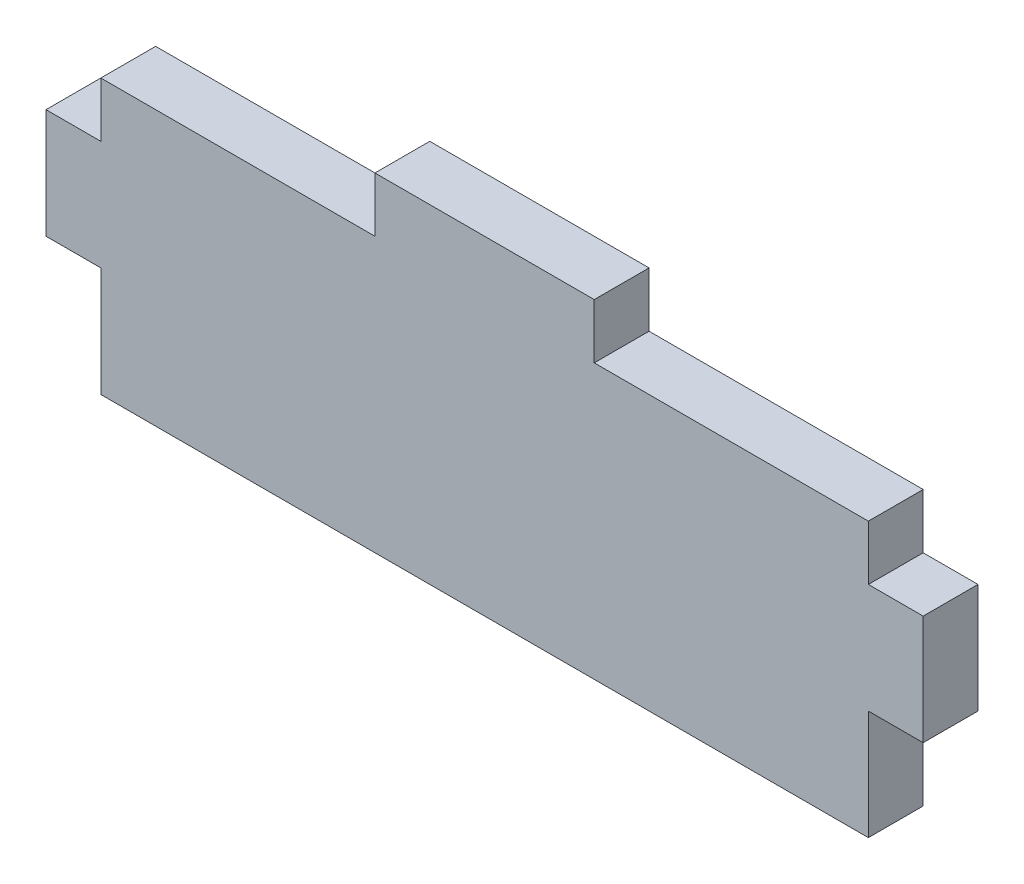
ISO-10303-21;
HEADER;
FILE_DESCRIPTION(('STEP AP214'),'2;1');
FILE_NAME('part.step','',(''),(''),'','','');
FILE_SCHEMA(('AUTOMOTIVE_DESIGN { 1 0 10303 214 1 1 1 1 }'));
ENDSEC;
DATA;
#1=APPLICATION_CONTEXT('core data for automotive mechanical design processes');
#2=APPLICATION_PROTOCOL_DEFINITION('international standard','automotive_design',2000,#1);
#3=PRODUCT_CONTEXT('',#1,'mechanical');
#4=PRODUCT('Part','Part','',(#3));
#5=PRODUCT_RELATED_PRODUCT_CATEGORY('part','',(#4));
#6=PRODUCT_DEFINITION_FORMATION('','',#4);
#7=PRODUCT_DEFINITION_CONTEXT('part definition',#1,'design');
#8=PRODUCT_DEFINITION('design','',#6,#7);
#9=PRODUCT_DEFINITION_SHAPE('','',#8);
#10=(LENGTH_UNIT() NAMED_UNIT(*) SI_UNIT(.MILLI.,.METRE.));
#11=(NAMED_UNIT(*) PLANE_ANGLE_UNIT() SI_UNIT($,.RADIAN.));
#12=(NAMED_UNIT(*) SI_UNIT($,.STERADIAN.) SOLID_ANGLE_UNIT());
#13=UNCERTAINTY_MEASURE_WITH_UNIT(LENGTH_MEASURE(1.E-05),#10,'distance_accuracy_value','');
#14=(GEOMETRIC_REPRESENTATION_CONTEXT(3) GLOBAL_UNCERTAINTY_ASSIGNED_CONTEXT((#13)) GLOBAL_UNIT_ASSIGNED_CONTEXT((#10,
#11,#12)) REPRESENTATION_CONTEXT('',''));
#15=CARTESIAN_POINT('',(0.,0.,0.));
#16=DIRECTION('',(0.,0.,1.));
#17=DIRECTION('',(1.,0.,0.));
#18=AXIS2_PLACEMENT_3D('',#15,#16,#17);
#19=CARTESIAN_POINT('',(83.7836782164158,0.,6.35));
#20=DIRECTION('',(1.,0.,0.));
#21=DIRECTION('',(0.,1.,0.));
#22=AXIS2_PLACEMENT_3D('',#19,#20,#21);
#23=PLANE('',#22);
#24=DIRECTION('',(0.,-1.,0.));
#25=VECTOR('',#24,1.);
#26=CARTESIAN_POINT('',(83.7836782164158,0.,0.));
#27=LINE('',#26,#25);
#28=CARTESIAN_POINT('',(83.7836782164158,19.051893638171,0.));
#29=VERTEX_POINT('',#28);
#30=CARTESIAN_POINT('',(83.7836782164158,12.701893638171,0.));
#31=VERTEX_POINT('',#30);
#32=EDGE_CURVE('E176',#29,#31,#27,.T.);
#33=ORIENTED_EDGE('',*,*,#32,.F.);
#34=DIRECTION('',(0.,0.,-1.));
#35=VECTOR('',#34,1.);
#36=CARTESIAN_POINT('',(83.7836782164158,19.051893638171,6.35));
#37=LINE('',#36,#35);
#38=CARTESIAN_POINT('',(83.7836782164158,19.051893638171,6.35));
#39=VERTEX_POINT('',#38);
#40=EDGE_CURVE('E11',#39,#29,#37,.T.);
#41=ORIENTED_EDGE('',*,*,#40,.F.);
#42=DIRECTION('',(0.,-1.,0.));
#43=VECTOR('',#42,1.);
#44=CARTESIAN_POINT('',(83.7836782164158,0.,6.35));
#45=LINE('',#44,#43);
#46=CARTESIAN_POINT('',(83.7836782164158,12.701893638171,6.35));
#47=VERTEX_POINT('',#46);
#48=EDGE_CURVE('E212',#39,#47,#45,.T.);
#49=ORIENTED_EDGE('',*,*,#48,.T.);
#50=DIRECTION('',(0.,0.,-1.));
#51=VECTOR('',#50,1.);
#52=CARTESIAN_POINT('',(83.7836782164158,12.701893638171,6.35));
#53=LINE('',#52,#51);
#54=EDGE_CURVE('E52',#47,#31,#53,.T.);
#55=ORIENTED_EDGE('',*,*,#54,.T.);
#56=EDGE_LOOP('',(#33,#41,#49,#55));
#57=FACE_BOUND('',#56,.T.);
#58=ADVANCED_FACE('F35',(#57),#23,.T.);
#59=CARTESIAN_POINT('',(0.,19.051893638171,6.35));
#60=DIRECTION('',(0.,1.,0.));
#61=DIRECTION('',(-1.,0.,0.));
#62=AXIS2_PLACEMENT_3D('',#59,#60,#61);
#63=PLANE('',#62);
#64=DIRECTION('',(1.,0.,0.));
#65=VECTOR('',#64,1.);
#66=CARTESIAN_POINT('',(0.,19.051893638171,0.));
#67=LINE('',#66,#65);
#68=CARTESIAN_POINT('',(52.0336782164157,19.051893638171,0.));
#69=VERTEX_POINT('',#68);
#70=EDGE_CURVE('E178',#69,#29,#67,.T.);
#71=ORIENTED_EDGE('',*,*,#70,.F.);
#72=DIRECTION('',(0.,0.,-1.));
#73=VECTOR('',#72,1.);
#74=CARTESIAN_POINT('',(52.0336782164157,19.051893638171,6.35));
#75=LINE('',#74,#73);
#76=CARTESIAN_POINT('',(52.0336782164157,19.051893638171,6.35));
#77=VERTEX_POINT('',#76);
#78=EDGE_CURVE('E44',#77,#69,#75,.T.);
#79=ORIENTED_EDGE('',*,*,#78,.F.);
#80=DIRECTION('',(1.,0.,0.));
#81=VECTOR('',#80,1.);
#82=CARTESIAN_POINT('',(0.,19.051893638171,6.35));
#83=LINE('',#82,#81);
#84=EDGE_CURVE('E259',#77,#39,#83,.T.);
#85=ORIENTED_EDGE('',*,*,#84,.T.);
#86=ORIENTED_EDGE('',*,*,#40,.T.);
#87=EDGE_LOOP('',(#71,#79,#85,#86));
#88=FACE_BOUND('',#87,.T.);
#89=ADVANCED_FACE('F247',(#88),#63,.T.);
#90=CARTESIAN_POINT('',(52.0336782164157,0.,6.35));
#91=DIRECTION('',(1.,0.,0.));
#92=DIRECTION('',(0.,0.,-1.));
#93=AXIS2_PLACEMENT_3D('',#90,#91,#92);
#94=PLANE('',#93);
#95=DIRECTION('',(0.,-1.,0.));
#96=VECTOR('',#95,1.);
#97=CARTESIAN_POINT('',(52.0336782164157,0.,0.));
#98=LINE('',#97,#96);
#99=CARTESIAN_POINT('',(52.0336782164157,25.401893638171,0.));
#100=VERTEX_POINT('',#99);
#101=EDGE_CURVE('E182',#100,#69,#98,.T.);
#102=ORIENTED_EDGE('',*,*,#101,.F.);
#103=DIRECTION('',(0.,0.,-1.));
#104=VECTOR('',#103,1.);
#105=CARTESIAN_POINT('',(52.0336782164157,25.401893638171,6.35));
#106=LINE('',#105,#104);
#107=CARTESIAN_POINT('',(52.0336782164157,25.401893638171,6.35));
#108=VERTEX_POINT('',#107);
#109=EDGE_CURVE('E237',#108,#100,#106,.T.);
#110=ORIENTED_EDGE('',*,*,#109,.F.);
#111=DIRECTION('',(0.,-1.,0.));
#112=VECTOR('',#111,1.);
#113=CARTESIAN_POINT('',(52.0336782164157,0.,6.35));
#114=LINE('',#113,#112);
#115=EDGE_CURVE('E243',#108,#77,#114,.T.);
#116=ORIENTED_EDGE('',*,*,#115,.T.);
#117=ORIENTED_EDGE('',*,*,#78,.T.);
#118=EDGE_LOOP('',(#102,#110,#116,#117));
#119=FACE_BOUND('',#118,.T.);
#120=ADVANCED_FACE('F37',(#119),#94,.T.);
#121=CARTESIAN_POINT('',(0.,25.401893638171,6.35));
#122=DIRECTION('',(0.,1.,0.));
#123=DIRECTION('',(0.,0.,1.));
#124=AXIS2_PLACEMENT_3D('',#121,#122,#123);
#125=PLANE('',#124);
#126=DIRECTION('',(1.,0.,0.));
#127=VECTOR('',#126,1.);
#128=CARTESIAN_POINT('',(0.,25.401893638171,0.));
#129=LINE('',#128,#127);
#130=CARTESIAN_POINT('',(26.6336782164157,25.401893638171,0.));
#131=VERTEX_POINT('',#130);
#132=EDGE_CURVE('E186',#131,#100,#129,.T.);
#133=ORIENTED_EDGE('',*,*,#132,.F.);
#134=DIRECTION('',(0.,0.,-1.));
#135=VECTOR('',#134,1.);
#136=CARTESIAN_POINT('',(26.6336782164157,25.401893638171,6.35));
#137=LINE('',#136,#135);
#138=CARTESIAN_POINT('',(26.6336782164157,25.401893638171,6.35));
#139=VERTEX_POINT('',#138);
#140=EDGE_CURVE('E235',#139,#131,#137,.T.);
#141=ORIENTED_EDGE('',*,*,#140,.F.);
#142=DIRECTION('',(1.,0.,0.));
#143=VECTOR('',#142,1.);
#144=CARTESIAN_POINT('',(0.,25.401893638171,6.35));
#145=LINE('',#144,#143);
#146=EDGE_CURVE('E258',#139,#108,#145,.T.);
#147=ORIENTED_EDGE('',*,*,#146,.T.);
#148=ORIENTED_EDGE('',*,*,#109,.T.);
#149=EDGE_LOOP('',(#133,#141,#147,#148));
#150=FACE_BOUND('',#149,.T.);
#151=ADVANCED_FACE('F254',(#150),#125,.T.);
#152=CARTESIAN_POINT('',(26.6336782164157,0.,6.35));
#153=DIRECTION('',(1.,0.,0.));
#154=DIRECTION('',(0.,1.,0.));
#155=AXIS2_PLACEMENT_3D('',#152,#153,#154);
#156=PLANE('',#155);
#157=DIRECTION('',(0.,-1.,0.));
#158=VECTOR('',#157,1.);
#159=CARTESIAN_POINT('',(26.6336782164157,0.,0.));
#160=LINE('',#159,#158);
#161=CARTESIAN_POINT('',(26.6336782164157,19.051893638171,0.));
#162=VERTEX_POINT('',#161);
#163=EDGE_CURVE('E189',#131,#162,#160,.T.);
#164=ORIENTED_EDGE('',*,*,#163,.T.);
#165=DIRECTION('',(0.,0.,-1.));
#166=VECTOR('',#165,1.);
#167=CARTESIAN_POINT('',(26.6336782164157,19.051893638171,6.35));
#168=LINE('',#167,#166);
#169=CARTESIAN_POINT('',(26.6336782164157,19.051893638171,6.35));
#170=VERTEX_POINT('',#169);
#171=EDGE_CURVE('E233',#170,#162,#168,.T.);
#172=ORIENTED_EDGE('',*,*,#171,.F.);
#173=DIRECTION('',(0.,-1.,0.));
#174=VECTOR('',#173,1.);
#175=CARTESIAN_POINT('',(26.6336782164157,0.,6.35));
#176=LINE('',#175,#174);
#177=EDGE_CURVE('E261',#139,#170,#176,.T.);
#178=ORIENTED_EDGE('',*,*,#177,.F.);
#179=ORIENTED_EDGE('',*,*,#140,.T.);
#180=EDGE_LOOP('',(#164,#172,#178,#179));
#181=FACE_BOUND('',#180,.T.);
#182=ADVANCED_FACE('F337',(#181),#156,.F.);
#183=CARTESIAN_POINT('',(-5.11632178358423,19.051893638171,0.));
#184=VERTEX_POINT('',#183);
#185=EDGE_CURVE('E183',#184,#162,#67,.T.);
#186=ORIENTED_EDGE('',*,*,#185,.F.);
#187=DIRECTION('',(0.,0.,-1.));
#188=VECTOR('',#187,1.);
#189=CARTESIAN_POINT('',(-5.11632178358423,19.051893638171,6.35));
#190=LINE('',#189,#188);
#191=CARTESIAN_POINT('',(-5.11632178358423,19.051893638171,6.35));
#192=VERTEX_POINT('',#191);
#193=EDGE_CURVE('E231',#192,#184,#190,.T.);
#194=ORIENTED_EDGE('',*,*,#193,.F.);
#195=EDGE_CURVE('E264',#192,#170,#83,.T.);
#196=ORIENTED_EDGE('',*,*,#195,.T.);
#197=ORIENTED_EDGE('',*,*,#171,.T.);
#198=EDGE_LOOP('',(#186,#194,#196,#197));
#199=FACE_BOUND('',#198,.T.);
#200=ADVANCED_FACE('F310',(#199),#63,.T.);
#201=CARTESIAN_POINT('',(-5.11632178358423,0.,6.35));
#202=DIRECTION('',(1.,0.,0.));
#203=DIRECTION('',(0.,1.,0.));
#204=AXIS2_PLACEMENT_3D('',#201,#202,#203);
#205=PLANE('',#204);
#206=DIRECTION('',(0.,-1.,0.));
#207=VECTOR('',#206,1.);
#208=CARTESIAN_POINT('',(-5.11632178358423,0.,0.));
#209=LINE('',#208,#207);
#210=CARTESIAN_POINT('',(-5.11632178358423,12.701893638171,0.));
#211=VERTEX_POINT('',#210);
#212=EDGE_CURVE('E192',#184,#211,#209,.T.);
#213=ORIENTED_EDGE('',*,*,#212,.T.);
#214=DIRECTION('',(0.,0.,-1.));
#215=VECTOR('',#214,1.);
#216=CARTESIAN_POINT('',(-5.11632178358423,12.701893638171,6.35));
#217=LINE('',#216,#215);
#218=CARTESIAN_POINT('',(-5.11632178358423,12.701893638171,6.35));
#219=VERTEX_POINT('',#218);
#220=EDGE_CURVE('E229',#219,#211,#217,.T.);
#221=ORIENTED_EDGE('',*,*,#220,.F.);
#222=DIRECTION('',(0.,-1.,0.));
#223=VECTOR('',#222,1.);
#224=CARTESIAN_POINT('',(-5.11632178358423,0.,6.35));
#225=LINE('',#224,#223);
#226=EDGE_CURVE('E268',#192,#219,#225,.T.);
#227=ORIENTED_EDGE('',*,*,#226,.F.);
#228=ORIENTED_EDGE('',*,*,#193,.T.);
#229=EDGE_LOOP('',(#213,#221,#227,#228));
#230=FACE_BOUND('',#229,.T.);
#231=ADVANCED_FACE('F323',(#230),#205,.F.);
#232=CARTESIAN_POINT('',(0.,12.701893638171,6.35));
#233=DIRECTION('',(0.,1.,0.));
#234=DIRECTION('',(-1.,0.,0.));
#235=AXIS2_PLACEMENT_3D('',#232,#233,#234);
#236=PLANE('',#235);
#237=DIRECTION('',(1.,0.,0.));
#238=VECTOR('',#237,1.);
#239=CARTESIAN_POINT('',(0.,12.701893638171,0.));
#240=LINE('',#239,#238);
#241=CARTESIAN_POINT('',(-11.4663217835842,12.701893638171,0.));
#242=VERTEX_POINT('',#241);
#243=EDGE_CURVE('E195',#242,#211,#240,.T.);
#244=ORIENTED_EDGE('',*,*,#243,.F.);
#245=DIRECTION('',(0.,0.,-1.));
#246=VECTOR('',#245,1.);
#247=CARTESIAN_POINT('',(-11.4663217835842,12.701893638171,6.35));
#248=LINE('',#247,#246);
#249=CARTESIAN_POINT('',(-11.4663217835842,12.701893638171,6.35));
#250=VERTEX_POINT('',#249);
#251=EDGE_CURVE('E227',#250,#242,#248,.T.);
#252=ORIENTED_EDGE('',*,*,#251,.F.);
#253=DIRECTION('',(1.,0.,0.));
#254=VECTOR('',#253,1.);
#255=CARTESIAN_POINT('',(0.,12.701893638171,6.35));
#256=LINE('',#255,#254);
#257=EDGE_CURVE('E270',#250,#219,#256,.T.);
#258=ORIENTED_EDGE('',*,*,#257,.T.);
#259=ORIENTED_EDGE('',*,*,#220,.T.);
#260=EDGE_LOOP('',(#244,#252,#258,#259));
#261=FACE_BOUND('',#260,.T.);
#262=ADVANCED_FACE('F331',(#261),#236,.T.);
#263=CARTESIAN_POINT('',(-11.4663217835842,0.,6.35));
#264=DIRECTION('',(1.,0.,0.));
#265=DIRECTION('',(0.,1.,0.));
#266=AXIS2_PLACEMENT_3D('',#263,#264,#265);
#267=PLANE('',#266);
#268=DIRECTION('',(0.,-1.,0.));
#269=VECTOR('',#268,1.);
#270=CARTESIAN_POINT('',(-11.4663217835842,0.,0.));
#271=LINE('',#270,#269);
#272=CARTESIAN_POINT('',(-11.4663217835842,0.00189363817097721,0.));
#273=VERTEX_POINT('',#272);
#274=EDGE_CURVE('E199',#242,#273,#271,.T.);
#275=ORIENTED_EDGE('',*,*,#274,.T.);
#276=DIRECTION('',(0.,0.,-1.));
#277=VECTOR('',#276,1.);
#278=CARTESIAN_POINT('',(-11.4663217835842,0.00189363817097721,6.35));
#279=LINE('',#278,#277);
#280=CARTESIAN_POINT('',(-11.4663217835842,0.00189363817097721,6.35));
#281=VERTEX_POINT('',#280);
#282=EDGE_CURVE('E224',#281,#273,#279,.T.);
#283=ORIENTED_EDGE('',*,*,#282,.F.);
#284=DIRECTION('',(0.,-1.,0.));
#285=VECTOR('',#284,1.);
#286=CARTESIAN_POINT('',(-11.4663217835842,0.,6.35));
#287=LINE('',#286,#285);
#288=EDGE_CURVE('E274',#250,#281,#287,.T.);
#289=ORIENTED_EDGE('',*,*,#288,.F.);
#290=ORIENTED_EDGE('',*,*,#251,.T.);
#291=EDGE_LOOP('',(#275,#283,#289,#290));
#292=FACE_BOUND('',#291,.T.);
#293=ADVANCED_FACE('F327',(#292),#267,.F.);
#294=CARTESIAN_POINT('',(0.,0.00189363817097721,6.35));
#295=DIRECTION('',(0.,1.,0.));
#296=DIRECTION('',(0.,0.,1.));
#297=AXIS2_PLACEMENT_3D('',#294,#295,#296);
#298=PLANE('',#297);
#299=DIRECTION('',(1.,0.,0.));
#300=VECTOR('',#299,1.);
#301=CARTESIAN_POINT('',(0.,0.00189363817097721,0.));
#302=LINE('',#301,#300);
#303=CARTESIAN_POINT('',(-5.11632178358423,0.00189363817097721,0.));
#304=VERTEX_POINT('',#303);
#305=EDGE_CURVE('E201',#273,#304,#302,.T.);
#306=ORIENTED_EDGE('',*,*,#305,.T.);
#307=DIRECTION('',(0.,0.,-1.));
#308=VECTOR('',#307,1.);
#309=CARTESIAN_POINT('',(-5.11632178358423,0.00189363817097721,6.35));
#310=LINE('',#309,#308);
#311=CARTESIAN_POINT('',(-5.11632178358423,0.00189363817097721,6.35));
#312=VERTEX_POINT('',#311);
#313=EDGE_CURVE('E221',#312,#304,#310,.T.);
#314=ORIENTED_EDGE('',*,*,#313,.F.);
#315=DIRECTION('',(1.,0.,0.));
#316=VECTOR('',#315,1.);
#317=CARTESIAN_POINT('',(0.,0.00189363817097721,6.35));
#318=LINE('',#317,#316);
#319=EDGE_CURVE('E276',#281,#312,#318,.T.);
#320=ORIENTED_EDGE('',*,*,#319,.F.);
#321=ORIENTED_EDGE('',*,*,#282,.T.);
#322=EDGE_LOOP('',(#306,#314,#320,#321));
#323=FACE_BOUND('',#322,.T.);
#324=ADVANCED_FACE('F321',(#323),#298,.F.);
#325=CARTESIAN_POINT('',(-5.11632178358423,-12.698106361829,0.));
#326=VERTEX_POINT('',#325);
#327=EDGE_CURVE('E196',#304,#326,#209,.T.);
#328=ORIENTED_EDGE('',*,*,#327,.T.);
#329=DIRECTION('',(0.,0.,-1.));
#330=VECTOR('',#329,1.);
#331=CARTESIAN_POINT('',(-5.11632178358423,-12.698106361829,6.35));
#332=LINE('',#331,#330);
#333=CARTESIAN_POINT('',(-5.11632178358423,-12.698106361829,6.35));
#334=VERTEX_POINT('',#333);
#335=EDGE_CURVE('E218',#334,#326,#332,.T.);
#336=ORIENTED_EDGE('',*,*,#335,.F.);
#337=EDGE_CURVE('E271',#312,#334,#225,.T.);
#338=ORIENTED_EDGE('',*,*,#337,.F.);
#339=ORIENTED_EDGE('',*,*,#313,.T.);
#340=EDGE_LOOP('',(#328,#336,#338,#339));
#341=FACE_BOUND('',#340,.T.);
#342=ADVANCED_FACE('F285',(#341),#205,.F.);
#343=CARTESIAN_POINT('',(0.,-12.698106361829,6.35));
#344=DIRECTION('',(0.,1.,0.));
#345=DIRECTION('',(0.,0.,1.));
#346=AXIS2_PLACEMENT_3D('',#343,#344,#345);
#347=PLANE('',#346);
#348=DIRECTION('',(1.,0.,0.));
#349=VECTOR('',#348,1.);
#350=CARTESIAN_POINT('',(0.,-12.698106361829,0.));
#351=LINE('',#350,#349);
#352=CARTESIAN_POINT('',(83.7836782164158,-12.698106361829,0.));
#353=VERTEX_POINT('',#352);
#354=EDGE_CURVE('E203',#326,#353,#351,.T.);
#355=ORIENTED_EDGE('',*,*,#354,.T.);
#356=DIRECTION('',(0.,0.,-1.));
#357=VECTOR('',#356,1.);
#358=CARTESIAN_POINT('',(83.7836782164158,-12.698106361829,6.35));
#359=LINE('',#358,#357);
#360=CARTESIAN_POINT('',(83.7836782164158,-12.698106361829,6.35));
#361=VERTEX_POINT('',#360);
#362=EDGE_CURVE('E216',#361,#353,#359,.T.);
#363=ORIENTED_EDGE('',*,*,#362,.F.);
#364=DIRECTION('',(1.,0.,0.));
#365=VECTOR('',#364,1.);
#366=CARTESIAN_POINT('',(0.,-12.698106361829,6.35));
#367=LINE('',#366,#365);
#368=EDGE_CURVE('E277',#334,#361,#367,.T.);
#369=ORIENTED_EDGE('',*,*,#368,.F.);
#370=ORIENTED_EDGE('',*,*,#335,.T.);
#371=EDGE_LOOP('',(#355,#363,#369,#370));
#372=FACE_BOUND('',#371,.T.);
#373=ADVANCED_FACE('F289',(#372),#347,.F.);
#374=CARTESIAN_POINT('',(83.7836782164158,0.00189363817097591,0.));
#375=VERTEX_POINT('',#374);
#376=EDGE_CURVE('E179',#375,#353,#27,.T.);
#377=ORIENTED_EDGE('',*,*,#376,.F.);
#378=DIRECTION('',(0.,0.,-1.));
#379=VECTOR('',#378,1.);
#380=CARTESIAN_POINT('',(83.7836782164158,0.00189363817097591,6.35));
#381=LINE('',#380,#379);
#382=CARTESIAN_POINT('',(83.7836782164158,0.00189363817097591,6.35));
#383=VERTEX_POINT('',#382);
#384=EDGE_CURVE('E168',#383,#375,#381,.T.);
#385=ORIENTED_EDGE('',*,*,#384,.F.);
#386=EDGE_CURVE('E158',#383,#361,#45,.T.);
#387=ORIENTED_EDGE('',*,*,#386,.T.);
#388=ORIENTED_EDGE('',*,*,#362,.T.);
#389=EDGE_LOOP('',(#377,#385,#387,#388));
#390=FACE_BOUND('',#389,.T.);
#391=ADVANCED_FACE('F293',(#390),#23,.T.);
#392=CARTESIAN_POINT('',(0.,0.00189363817098163,6.35));
#393=DIRECTION('',(0.,1.,0.));
#394=DIRECTION('',(-1.,0.,0.));
#395=AXIS2_PLACEMENT_3D('',#392,#393,#394);
#396=PLANE('',#395);
#397=DIRECTION('',(1.,0.,0.));
#398=VECTOR('',#397,1.);
#399=CARTESIAN_POINT('',(0.,0.00189363817098163,0.));
#400=LINE('',#399,#398);
#401=CARTESIAN_POINT('',(90.1336782164158,0.00189363817097547,0.));
#402=VERTEX_POINT('',#401);
#403=EDGE_CURVE('E165',#375,#402,#400,.T.);
#404=ORIENTED_EDGE('',*,*,#403,.T.);
#405=DIRECTION('',(0.,0.,-1.));
#406=VECTOR('',#405,1.);
#407=CARTESIAN_POINT('',(90.1336782164158,0.00189363817097547,6.35));
#408=LINE('',#407,#406);
#409=CARTESIAN_POINT('',(90.1336782164158,0.00189363817097547,6.35));
#410=VERTEX_POINT('',#409);
#411=EDGE_CURVE('E162',#410,#402,#408,.T.);
#412=ORIENTED_EDGE('',*,*,#411,.F.);
#413=DIRECTION('',(1.,0.,0.));
#414=VECTOR('',#413,1.);
#415=CARTESIAN_POINT('',(0.,0.00189363817098163,6.35));
#416=LINE('',#415,#414);
#417=EDGE_CURVE('E151',#383,#410,#416,.T.);
#418=ORIENTED_EDGE('',*,*,#417,.F.);
#419=ORIENTED_EDGE('',*,*,#384,.T.);
#420=EDGE_LOOP('',(#404,#412,#418,#419));
#421=FACE_BOUND('',#420,.T.);
#422=ADVANCED_FACE('F163',(#421),#396,.F.);
#423=CARTESIAN_POINT('',(90.1336782164158,0.,6.35));
#424=DIRECTION('',(1.,0.,0.));
#425=DIRECTION('',(0.,0.,-1.));
#426=AXIS2_PLACEMENT_3D('',#423,#424,#425);
#427=PLANE('',#426);
#428=DIRECTION('',(0.,-1.,0.));
#429=VECTOR('',#428,1.);
#430=CARTESIAN_POINT('',(90.1336782164158,0.,0.));
#431=LINE('',#430,#429);
#432=CARTESIAN_POINT('',(90.1336782164158,12.701893638171,0.));
#433=VERTEX_POINT('',#432);
#434=EDGE_CURVE('E207',#433,#402,#431,.T.);
#435=ORIENTED_EDGE('',*,*,#434,.F.);
#436=DIRECTION('',(0.,0.,-1.));
#437=VECTOR('',#436,1.);
#438=CARTESIAN_POINT('',(90.1336782164158,12.701893638171,6.35));
#439=LINE('',#438,#437);
#440=CARTESIAN_POINT('',(90.1336782164158,12.701893638171,6.35));
#441=VERTEX_POINT('',#440);
#442=EDGE_CURVE('E101',#441,#433,#439,.T.);
#443=ORIENTED_EDGE('',*,*,#442,.F.);
#444=DIRECTION('',(0.,-1.,0.));
#445=VECTOR('',#444,1.);
#446=CARTESIAN_POINT('',(90.1336782164158,0.,6.35));
#447=LINE('',#446,#445);
#448=EDGE_CURVE('E156',#441,#410,#447,.T.);
#449=ORIENTED_EDGE('',*,*,#448,.T.);
#450=ORIENTED_EDGE('',*,*,#411,.T.);
#451=EDGE_LOOP('',(#435,#443,#449,#450));
#452=FACE_BOUND('',#451,.T.);
#453=ADVANCED_FACE('F170',(#452),#427,.T.);
#454=CARTESIAN_POINT('',(0.,12.701893638171,6.35));
#455=DIRECTION('',(0.,1.,0.));
#456=DIRECTION('',(0.,0.,1.));
#457=AXIS2_PLACEMENT_3D('',#454,#455,#456);
#458=PLANE('',#457);
#459=DIRECTION('',(1.,0.,0.));
#460=VECTOR('',#459,1.);
#461=CARTESIAN_POINT('',(0.,12.701893638171,0.));
#462=LINE('',#461,#460);
#463=EDGE_CURVE('E209',#31,#433,#462,.T.);
#464=ORIENTED_EDGE('',*,*,#463,.F.);
#465=ORIENTED_EDGE('',*,*,#54,.F.);
#466=DIRECTION('',(1.,0.,0.));
#467=VECTOR('',#466,1.);
#468=CARTESIAN_POINT('',(0.,12.701893638171,6.35));
#469=LINE('',#468,#467);
#470=EDGE_CURVE('E171',#47,#441,#469,.T.);
#471=ORIENTED_EDGE('',*,*,#470,.T.);
#472=ORIENTED_EDGE('',*,*,#442,.T.);
#473=EDGE_LOOP('',(#464,#465,#471,#472));
#474=FACE_BOUND('',#473,.T.);
#475=ADVANCED_FACE('F294',(#474),#458,.T.);
#476=CARTESIAN_POINT('',(0.,0.,6.35));
#477=DIRECTION('',(0.,0.,1.));
#478=DIRECTION('',(1.,0.,0.));
#479=AXIS2_PLACEMENT_3D('',#476,#477,#478);
#480=PLANE('',#479);
#481=ORIENTED_EDGE('',*,*,#48,.F.);
#482=ORIENTED_EDGE('',*,*,#84,.F.);
#483=ORIENTED_EDGE('',*,*,#115,.F.);
#484=ORIENTED_EDGE('',*,*,#146,.F.);
#485=ORIENTED_EDGE('',*,*,#177,.T.);
#486=ORIENTED_EDGE('',*,*,#195,.F.);
#487=ORIENTED_EDGE('',*,*,#226,.T.);
#488=ORIENTED_EDGE('',*,*,#257,.F.);
#489=ORIENTED_EDGE('',*,*,#288,.T.);
#490=ORIENTED_EDGE('',*,*,#319,.T.);
#491=ORIENTED_EDGE('',*,*,#337,.T.);
#492=ORIENTED_EDGE('',*,*,#368,.T.);
#493=ORIENTED_EDGE('',*,*,#386,.F.);
#494=ORIENTED_EDGE('',*,*,#417,.T.);
#495=ORIENTED_EDGE('',*,*,#448,.F.);
#496=ORIENTED_EDGE('',*,*,#470,.F.);
#497=EDGE_LOOP('',(#481,#482,#483,#484,#485,#486,#487,#488,#489,#490,#491,#492,#493,#494,#495,#496));
#498=FACE_BOUND('',#497,.T.);
#499=ADVANCED_FACE('F153',(#498),#480,.T.);
#500=CARTESIAN_POINT('',(0.,0.,0.));
#501=DIRECTION('',(0.,0.,1.));
#502=DIRECTION('',(1.,0.,0.));
#503=AXIS2_PLACEMENT_3D('',#500,#501,#502);
#504=PLANE('',#503);
#505=ORIENTED_EDGE('',*,*,#32,.T.);
#506=ORIENTED_EDGE('',*,*,#463,.T.);
#507=ORIENTED_EDGE('',*,*,#434,.T.);
#508=ORIENTED_EDGE('',*,*,#403,.F.);
#509=ORIENTED_EDGE('',*,*,#376,.T.);
#510=ORIENTED_EDGE('',*,*,#354,.F.);
#511=ORIENTED_EDGE('',*,*,#327,.F.);
#512=ORIENTED_EDGE('',*,*,#305,.F.);
#513=ORIENTED_EDGE('',*,*,#274,.F.);
#514=ORIENTED_EDGE('',*,*,#243,.T.);
#515=ORIENTED_EDGE('',*,*,#212,.F.);
#516=ORIENTED_EDGE('',*,*,#185,.T.);
#517=ORIENTED_EDGE('',*,*,#163,.F.);
#518=ORIENTED_EDGE('',*,*,#132,.T.);
#519=ORIENTED_EDGE('',*,*,#101,.T.);
#520=ORIENTED_EDGE('',*,*,#70,.T.);
#521=EDGE_LOOP('',(#505,#506,#507,#508,#509,#510,#511,#512,#513,#514,#515,#516,#517,#518,#519,#520));
#522=FACE_BOUND('',#521,.T.);
#523=ADVANCED_FACE('F249',(#522),#504,.F.);
#524=CLOSED_SHELL('',(#58,#89,#120,#151,#182,#200,#231,#262,#293,#324,#342,#373,#391,#422,#453,
#475,#499,#523));
#525=MANIFOLD_SOLID_BREP('B2',#524);
#526=ADVANCED_BREP_SHAPE_REPRESENTATION('',(#18,#525),#14);
#527=SHAPE_DEFINITION_REPRESENTATION(#9,#526);
ENDSEC;
END-ISO-10303-21;
